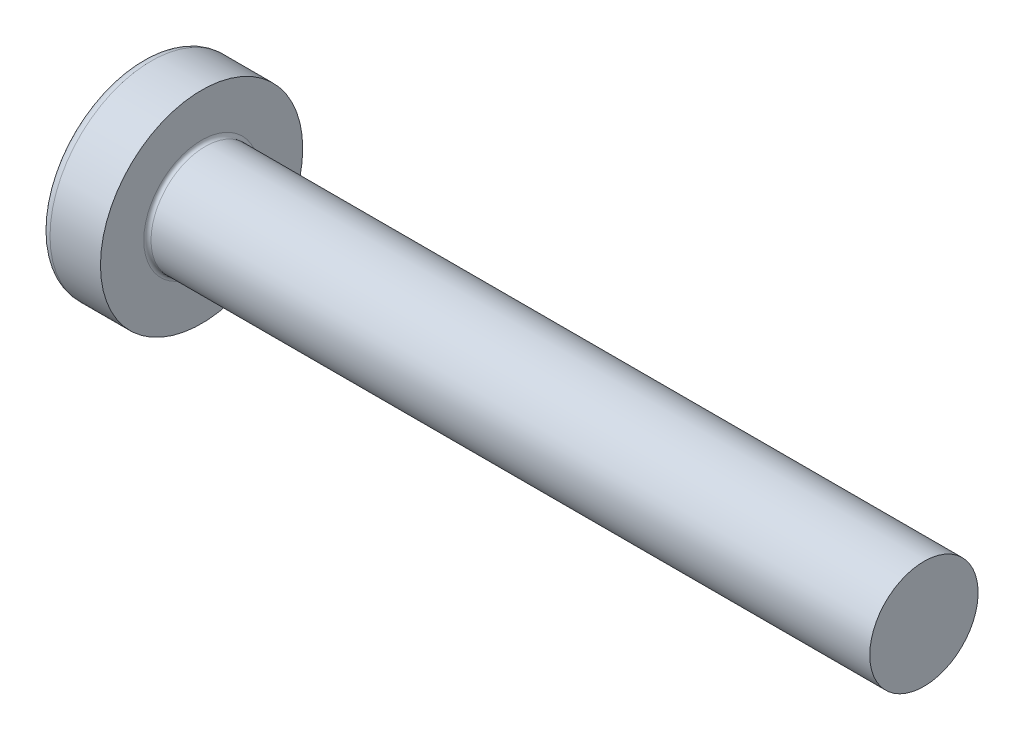
ISO-10303-21;
HEADER;
FILE_DESCRIPTION(('STEP AP214'),'2;1');
FILE_NAME('part.step','',(''),(''),'','','');
FILE_SCHEMA(('AUTOMOTIVE_DESIGN { 1 0 10303 214 1 1 1 1 }'));
ENDSEC;
DATA;
#1=APPLICATION_CONTEXT('core data for automotive mechanical design processes');
#2=APPLICATION_PROTOCOL_DEFINITION('international standard','automotive_design',2000,#1);
#3=PRODUCT_CONTEXT('',#1,'mechanical');
#4=PRODUCT('Part','Part','',(#3));
#5=PRODUCT_RELATED_PRODUCT_CATEGORY('part','',(#4));
#6=PRODUCT_DEFINITION_FORMATION('','',#4);
#7=PRODUCT_DEFINITION_CONTEXT('part definition',#1,'design');
#8=PRODUCT_DEFINITION('design','',#6,#7);
#9=PRODUCT_DEFINITION_SHAPE('','',#8);
#10=(LENGTH_UNIT() NAMED_UNIT(*) SI_UNIT(.MILLI.,.METRE.));
#11=(NAMED_UNIT(*) PLANE_ANGLE_UNIT() SI_UNIT($,.RADIAN.));
#12=(NAMED_UNIT(*) SI_UNIT($,.STERADIAN.) SOLID_ANGLE_UNIT());
#13=UNCERTAINTY_MEASURE_WITH_UNIT(LENGTH_MEASURE(1.E-05),#10,'distance_accuracy_value','');
#14=(GEOMETRIC_REPRESENTATION_CONTEXT(3) GLOBAL_UNCERTAINTY_ASSIGNED_CONTEXT((#13)) GLOBAL_UNIT_ASSIGNED_CONTEXT((#10,
#11,#12)) REPRESENTATION_CONTEXT('',''));
#15=CARTESIAN_POINT('',(0.,0.,0.));
#16=DIRECTION('',(0.,0.,1.));
#17=DIRECTION('',(1.,0.,0.));
#18=AXIS2_PLACEMENT_3D('',#15,#16,#17);
#19=CARTESIAN_POINT('',(5.,0.,0.));
#20=DIRECTION('',(-1.,0.,0.));
#21=DIRECTION('',(0.,1.,0.));
#22=AXIS2_PLACEMENT_3D('',#19,#20,#21);
#23=SPHERICAL_SURFACE('',#22,5.);
#24=CARTESIAN_POINT('',(0.775371598933733,0.,0.));
#25=DIRECTION('',(-1.,0.,0.));
#26=DIRECTION('',(0.,0.,1.));
#27=AXIS2_PLACEMENT_3D('',#24,#25,#26);
#28=CIRCLE('',#27,2.67441860465116);
#29=CARTESIAN_POINT('',(0.775371598933733,0.,2.67441860465116));
#30=VERTEX_POINT('',#29);
#31=EDGE_CURVE('E285',#30,#30,#28,.T.);
#32=ORIENTED_EDGE('',*,*,#31,.T.);
#33=EDGE_LOOP('',(#32));
#34=FACE_BOUND('',#33,.T.);
#35=CARTESIAN_POINT('',(0.0457951200896417,0.,0.));
#36=DIRECTION('',(1.,0.,0.));
#37=DIRECTION('',(0.,0.,-1.));
#38=AXIS2_PLACEMENT_3D('',#35,#36,#37);
#39=CIRCLE('',#38,0.675169614150692);
#40=CARTESIAN_POINT('',(0.0457951200896426,-0.369999999999998,-0.564760133040918));
#41=VERTEX_POINT('',#40);
#42=CARTESIAN_POINT('',(0.0457951200896417,-0.564760133040915,-0.37));
#43=VERTEX_POINT('',#42);
#44=EDGE_CURVE('E458',#41,#43,#39,.F.);
#45=ORIENTED_EDGE('',*,*,#44,.F.);
#46=CARTESIAN_POINT('',(5.,-0.37,0.));
#47=DIRECTION('',(0.,1.,0.));
#48=DIRECTION('',(0.,0.,1.));
#49=AXIS2_PLACEMENT_3D('',#46,#47,#48);
#50=CIRCLE('',#49,4.98629120689917);
#51=CARTESIAN_POINT('',(0.187869731256034,-0.369999999999995,-1.30633161051784));
#52=VERTEX_POINT('',#51);
#53=EDGE_CURVE('E365',#52,#41,#50,.T.);
#54=ORIENTED_EDGE('',*,*,#53,.F.);
#55=CARTESIAN_POINT('',(4.56358245832426,0.,0.875318202045668));
#56=DIRECTION('',(0.446197800778958,0.,-0.894934367749961));
#57=DIRECTION('',(-0.89493436774996,0.,-0.446197800778958));
#58=AXIS2_PLACEMENT_3D('',#55,#56,#57);
#59=CIRCLE('',#58,4.90340267309195);
#60=CARTESIAN_POINT('',(0.187869731256034,0.370000000000005,-1.30633161051784));
#61=VERTEX_POINT('',#60);
#62=EDGE_CURVE('E329',#52,#61,#59,.T.);
#63=ORIENTED_EDGE('',*,*,#62,.T.);
#64=CARTESIAN_POINT('',(5.,0.37,0.));
#65=DIRECTION('',(0.,-1.,0.));
#66=DIRECTION('',(0.,0.,-1.));
#67=AXIS2_PLACEMENT_3D('',#64,#65,#66);
#68=CIRCLE('',#67,4.98629120689917);
#69=CARTESIAN_POINT('',(0.0457951200896421,0.370000000000002,-0.564760133040916));
#70=VERTEX_POINT('',#69);
#71=EDGE_CURVE('E397',#70,#61,#68,.T.);
#72=ORIENTED_EDGE('',*,*,#71,.F.);
#73=CARTESIAN_POINT('',(0.0457951200896417,0.564760133040916,-0.37));
#74=VERTEX_POINT('',#73);
#75=EDGE_CURVE('E480',#74,#70,#39,.F.);
#76=ORIENTED_EDGE('',*,*,#75,.F.);
#77=CARTESIAN_POINT('',(5.,0.,-0.37));
#78=DIRECTION('',(0.,0.,1.));
#79=DIRECTION('',(1.,0.,0.));
#80=AXIS2_PLACEMENT_3D('',#77,#78,#79);
#81=CIRCLE('',#80,4.98629120689917);
#82=CARTESIAN_POINT('',(0.187869731256034,1.30633161051784,-0.37));
#83=VERTEX_POINT('',#82);
#84=EDGE_CURVE('E321',#83,#74,#81,.T.);
#85=ORIENTED_EDGE('',*,*,#84,.F.);
#86=CARTESIAN_POINT('',(4.56358245832426,-0.875318202045668,0.));
#87=DIRECTION('',(0.446197800778958,0.894934367749961,0.));
#88=DIRECTION('',(-0.89493436774996,0.446197800778958,0.));
#89=AXIS2_PLACEMENT_3D('',#86,#87,#88);
#90=CIRCLE('',#89,4.90340267309195);
#91=CARTESIAN_POINT('',(0.187869731256034,1.30633161051784,0.37));
#92=VERTEX_POINT('',#91);
#93=EDGE_CURVE('E325',#83,#92,#90,.T.);
#94=ORIENTED_EDGE('',*,*,#93,.T.);
#95=CARTESIAN_POINT('',(5.,0.,0.37));
#96=DIRECTION('',(0.,0.,-1.));
#97=DIRECTION('',(0.,1.,0.));
#98=AXIS2_PLACEMENT_3D('',#95,#96,#97);
#99=CIRCLE('',#98,4.98629120689917);
#100=CARTESIAN_POINT('',(0.0457951200896417,0.564760133040916,0.37));
#101=VERTEX_POINT('',#100);
#102=EDGE_CURVE('E316',#101,#92,#99,.T.);
#103=ORIENTED_EDGE('',*,*,#102,.F.);
#104=CARTESIAN_POINT('',(0.0457951200896426,0.369999999999998,0.564760133040918));
#105=VERTEX_POINT('',#104);
#106=EDGE_CURVE('E479',#105,#101,#39,.F.);
#107=ORIENTED_EDGE('',*,*,#106,.F.);
#108=CARTESIAN_POINT('',(0.187869731256034,0.369999999999995,1.30633161051784));
#109=VERTEX_POINT('',#108);
#110=EDGE_CURVE('E343',#109,#105,#68,.T.);
#111=ORIENTED_EDGE('',*,*,#110,.F.);
#112=CARTESIAN_POINT('',(4.56358245832426,0.,-0.875318202045669));
#113=DIRECTION('',(0.446197800778958,0.,0.894934367749961));
#114=DIRECTION('',(0.89493436774996,0.,-0.446197800778958));
#115=AXIS2_PLACEMENT_3D('',#112,#113,#114);
#116=CIRCLE('',#115,4.90340267309195);
#117=CARTESIAN_POINT('',(0.187869731256034,-0.370000000000005,1.30633161051784));
#118=VERTEX_POINT('',#117);
#119=EDGE_CURVE('E65',#109,#118,#116,.T.);
#120=ORIENTED_EDGE('',*,*,#119,.T.);
#121=CARTESIAN_POINT('',(0.0457951200896421,-0.370000000000002,0.564760133040916));
#122=VERTEX_POINT('',#121);
#123=EDGE_CURVE('E340',#122,#118,#50,.T.);
#124=ORIENTED_EDGE('',*,*,#123,.F.);
#125=CARTESIAN_POINT('',(0.0457951200896417,-0.564760133040916,0.37));
#126=VERTEX_POINT('',#125);
#127=EDGE_CURVE('E516',#126,#122,#39,.F.);
#128=ORIENTED_EDGE('',*,*,#127,.F.);
#129=CARTESIAN_POINT('',(0.187869731256034,-1.30633161051784,0.37));
#130=VERTEX_POINT('',#129);
#131=EDGE_CURVE('E317',#130,#126,#99,.T.);
#132=ORIENTED_EDGE('',*,*,#131,.F.);
#133=CARTESIAN_POINT('',(4.56358245832426,0.875318202045668,0.));
#134=DIRECTION('',(0.446197800778958,-0.894934367749961,0.));
#135=DIRECTION('',(0.89493436774996,0.446197800778958,0.));
#136=AXIS2_PLACEMENT_3D('',#133,#134,#135);
#137=CIRCLE('',#136,4.90340267309195);
#138=CARTESIAN_POINT('',(0.187869731256034,-1.30633161051784,-0.37));
#139=VERTEX_POINT('',#138);
#140=EDGE_CURVE('E312',#130,#139,#137,.T.);
#141=ORIENTED_EDGE('',*,*,#140,.T.);
#142=EDGE_CURVE('E82',#43,#139,#81,.T.);
#143=ORIENTED_EDGE('',*,*,#142,.F.);
#144=EDGE_LOOP('',(#45,#54,#63,#72,#76,#85,#94,#103,#107,#111,#120,#124,#128,#132,#141,#143));
#145=FACE_BOUND('',#144,.T.);
#146=ADVANCED_FACE('F52',(#34,#145),#23,.T.);
#147=CARTESIAN_POINT('',(1.75,0.527482216012805,-0.37));
#148=DIRECTION('',(0.,0.,1.));
#149=DIRECTION('',(1.,0.,0.));
#150=AXIS2_PLACEMENT_3D('',#147,#148,#149);
#151=PLANE('',#150);
#152=ORIENTED_EDGE('',*,*,#84,.T.);
#153=CARTESIAN_POINT('',(-0.987293237053716,0.649401255967161,-0.37));
#154=CARTESIAN_POINT('',(-0.781914975317084,0.632865887002871,-0.37));
#155=CARTESIAN_POINT('',(-0.576547882393372,0.616188977635081,-0.37));
#156=CARTESIAN_POINT('',(-0.165841599226327,0.582441031964227,-0.37));
#157=CARTESIAN_POINT('',(0.0394975903090452,0.56536998705488,-0.37));
#158=CARTESIAN_POINT('',(0.450133475422572,0.530723441326535,-0.37));
#159=CARTESIAN_POINT('',(0.655430171010573,0.513147940624557,-0.37));
#160=CARTESIAN_POINT('',(1.06596140177934,0.477314957985794,-0.37));
#161=CARTESIAN_POINT('',(1.2711959378071,0.459057485806066,-0.37));
#162=CARTESIAN_POINT('',(1.61065292365626,0.428051938688768,-0.37));
#163=CARTESIAN_POINT('',(1.74490059995643,0.415580824990931,-0.37));
#164=CARTESIAN_POINT('',(2.01334321762763,0.390092023404979,-0.37));
#165=CARTESIAN_POINT('',(2.14753815934577,0.377074339177353,-0.37));
#166=CARTESIAN_POINT('',(2.41586354151957,0.350315629452843,-0.37));
#167=CARTESIAN_POINT('',(2.5499939784531,0.33657456817765,-0.37));
#168=CARTESIAN_POINT('',(2.81814173295471,0.308004077741875,-0.37));
#169=CARTESIAN_POINT('',(2.95215904765134,0.293174621747065,-0.37));
#170=CARTESIAN_POINT('',(3.0860955068368,0.277618485071816,-0.37));
#171=B_SPLINE_CURVE_WITH_KNOTS('',3,(#153,#154,#155,#156,#157,#158,#159,#160,#161,#162,#163,
#164,#165,#166,#167,#168,#169,#170),.UNSPECIFIED.,.F.,.F.,(4,2,2,2,2,2,2,2,4),(0.,
0.618128793984691,1.23627109812525,1.85441325887562,2.4725465791681,2.87702276218609,
3.28149623678161,3.68598973550942,4.09049321032311),.UNSPECIFIED.);
#172=CARTESIAN_POINT('',(1.75,0.415013252800437,-0.37));
#173=VERTEX_POINT('',#172);
#174=EDGE_CURVE('E501',#74,#173,#171,.T.);
#175=ORIENTED_EDGE('',*,*,#174,.T.);
#176=DIRECTION('',(0.,1.,0.));
#177=VECTOR('',#176,1.);
#178=CARTESIAN_POINT('',(1.75,-0.527482216012805,-0.37));
#179=LINE('',#178,#177);
#180=CARTESIAN_POINT('',(1.75,0.527482216012805,-0.37));
#181=VERTEX_POINT('',#180);
#182=EDGE_CURVE('E436',#173,#181,#179,.T.);
#183=ORIENTED_EDGE('',*,*,#182,.T.);
#184=DIRECTION('',(0.89493436774996,-0.446197800778958,0.));
#185=VECTOR('',#184,1.);
#186=CARTESIAN_POINT('',(0.,1.4,-0.37));
#187=LINE('',#186,#185);
#188=EDGE_CURVE('E286',#83,#181,#187,.T.);
#189=ORIENTED_EDGE('',*,*,#188,.F.);
#190=EDGE_LOOP('',(#152,#175,#183,#189));
#191=FACE_BOUND('',#190,.T.);
#192=ADVANCED_FACE('F241',(#191),#151,.T.);
#193=CARTESIAN_POINT('',(1.75,-0.527482216012805,-0.37));
#194=VERTEX_POINT('',#193);
#195=CARTESIAN_POINT('',(1.75,-0.415013252800437,-0.37));
#196=VERTEX_POINT('',#195);
#197=EDGE_CURVE('E296',#194,#196,#179,.T.);
#198=ORIENTED_EDGE('',*,*,#197,.T.);
#199=CARTESIAN_POINT('',(-0.987293237053716,-0.649401255967161,-0.37));
#200=CARTESIAN_POINT('',(-0.781914975317084,-0.632865887002871,-0.37));
#201=CARTESIAN_POINT('',(-0.576547882393372,-0.616188977635081,-0.37));
#202=CARTESIAN_POINT('',(-0.165841599226327,-0.582441031964227,-0.37));
#203=CARTESIAN_POINT('',(0.0394975903090452,-0.56536998705488,-0.37));
#204=CARTESIAN_POINT('',(0.450133475422572,-0.530723441326535,-0.37));
#205=CARTESIAN_POINT('',(0.655430171010573,-0.513147940624557,-0.37));
#206=CARTESIAN_POINT('',(1.06596140177934,-0.477314957985794,-0.37));
#207=CARTESIAN_POINT('',(1.2711959378071,-0.459057485806066,-0.37));
#208=CARTESIAN_POINT('',(1.61065292365626,-0.428051938688768,-0.37));
#209=CARTESIAN_POINT('',(1.74490059995643,-0.415580824990931,-0.37));
#210=CARTESIAN_POINT('',(2.01334321762763,-0.390092023404979,-0.37));
#211=CARTESIAN_POINT('',(2.14753815934577,-0.377074339177353,-0.37));
#212=CARTESIAN_POINT('',(2.41586354151957,-0.350315629452843,-0.37));
#213=CARTESIAN_POINT('',(2.5499939784531,-0.33657456817765,-0.37));
#214=CARTESIAN_POINT('',(2.81814173295471,-0.308004077741875,-0.37));
#215=CARTESIAN_POINT('',(2.95215904765134,-0.293174621747065,-0.37));
#216=CARTESIAN_POINT('',(3.0860955068368,-0.277618485071816,-0.37));
#217=B_SPLINE_CURVE_WITH_KNOTS('',3,(#199,#200,#201,#202,#203,#204,#205,#206,#207,#208,#209,
#210,#211,#212,#213,#214,#215,#216),.UNSPECIFIED.,.F.,.F.,(4,2,2,2,2,2,2,2,4),(0.,
0.618128793984691,1.23627109812525,1.85441325887562,2.4725465791681,2.87702276218609,
3.28149623678161,3.68598973550942,4.09049321032311),.UNSPECIFIED.);
#218=EDGE_CURVE('E478',#196,#43,#217,.F.);
#219=ORIENTED_EDGE('',*,*,#218,.T.);
#220=ORIENTED_EDGE('',*,*,#142,.T.);
#221=DIRECTION('',(0.89493436774996,0.446197800778958,0.));
#222=VECTOR('',#221,1.);
#223=CARTESIAN_POINT('',(0.,-1.4,-0.37));
#224=LINE('',#223,#222);
#225=EDGE_CURVE('E401',#139,#194,#224,.T.);
#226=ORIENTED_EDGE('',*,*,#225,.T.);
#227=EDGE_LOOP('',(#198,#219,#220,#226));
#228=FACE_BOUND('',#227,.T.);
#229=ADVANCED_FACE('F247',(#228),#151,.T.);
#230=CARTESIAN_POINT('',(1.75,-0.527482216012805,0.37));
#231=DIRECTION('',(0.,0.,-1.));
#232=DIRECTION('',(0.,1.,0.));
#233=AXIS2_PLACEMENT_3D('',#230,#231,#232);
#234=PLANE('',#233);
#235=DIRECTION('',(0.,-1.,0.));
#236=VECTOR('',#235,1.);
#237=CARTESIAN_POINT('',(1.75,0.527482216012805,0.37));
#238=LINE('',#237,#236);
#239=CARTESIAN_POINT('',(1.75,0.527482216012805,0.37));
#240=VERTEX_POINT('',#239);
#241=CARTESIAN_POINT('',(1.75,0.415013252800437,0.37));
#242=VERTEX_POINT('',#241);
#243=EDGE_CURVE('E412',#240,#242,#238,.T.);
#244=ORIENTED_EDGE('',*,*,#243,.T.);
#245=CARTESIAN_POINT('',(-0.987293237069635,0.649401255968442,0.37));
#246=CARTESIAN_POINT('',(-0.781914975331301,0.632865887004023,0.37));
#247=CARTESIAN_POINT('',(-0.576547882405888,0.616188977636102,0.37));
#248=CARTESIAN_POINT('',(-0.16584159923544,0.582441031964983,0.37));
#249=CARTESIAN_POINT('',(0.0394975903016338,0.5653699870555,0.37));
#250=CARTESIAN_POINT('',(0.450133475420601,0.530723441326706,0.37));
#251=CARTESIAN_POINT('',(0.655430171012341,0.513147940624409,0.37));
#252=CARTESIAN_POINT('',(1.06596140178858,0.477314957984981,0.37));
#253=CARTESIAN_POINT('',(1.27119593782008,0.459057485804908,0.37));
#254=CARTESIAN_POINT('',(1.61065292367297,0.428051938687225,0.37));
#255=CARTESIAN_POINT('',(1.74490059997313,0.415580824989367,0.37));
#256=CARTESIAN_POINT('',(2.01334321764434,0.39009202340337,0.37));
#257=CARTESIAN_POINT('',(2.14753815936247,0.377074339175718,0.37));
#258=CARTESIAN_POINT('',(2.41586354153627,0.350315629451146,0.37));
#259=CARTESIAN_POINT('',(2.54999397846979,0.336574568175918,0.37));
#260=CARTESIAN_POINT('',(2.8181417329714,0.308004077740054,0.37));
#261=CARTESIAN_POINT('',(2.95215904766802,0.29317462174519,0.37));
#262=CARTESIAN_POINT('',(3.08609550685347,0.277618485069873,0.37));
#263=B_SPLINE_CURVE_WITH_KNOTS('',3,(#245,#246,#247,#248,#249,#250,#251,#252,#253,#254,#255,
#256,#257,#258,#259,#260,#261,#262),.UNSPECIFIED.,.F.,.F.,(4,2,2,2,2,2,2,2,4),(0.,
0.61812879398981,1.23627109813549,1.85441325889711,2.47254657920086,2.87702276221884,
3.28149623681436,3.68598973554218,4.09049321035586),.UNSPECIFIED.);
#264=EDGE_CURVE('E763',#242,#101,#263,.F.);
#265=ORIENTED_EDGE('',*,*,#264,.T.);
#266=ORIENTED_EDGE('',*,*,#102,.T.);
#267=DIRECTION('',(0.89493436774996,-0.446197800778958,0.));
#268=VECTOR('',#267,1.);
#269=CARTESIAN_POINT('',(0.,1.4,0.37));
#270=LINE('',#269,#268);
#271=EDGE_CURVE('E293',#92,#240,#270,.T.);
#272=ORIENTED_EDGE('',*,*,#271,.T.);
#273=EDGE_LOOP('',(#244,#265,#266,#272));
#274=FACE_BOUND('',#273,.T.);
#275=ADVANCED_FACE('F497',(#274),#234,.T.);
#276=ORIENTED_EDGE('',*,*,#131,.T.);
#277=CARTESIAN_POINT('',(-0.987293237069635,-0.649401255968442,0.37));
#278=CARTESIAN_POINT('',(-0.781914975331301,-0.632865887004023,0.37));
#279=CARTESIAN_POINT('',(-0.576547882405888,-0.616188977636102,0.37));
#280=CARTESIAN_POINT('',(-0.16584159923544,-0.582441031964983,0.37));
#281=CARTESIAN_POINT('',(0.0394975903016338,-0.5653699870555,0.37));
#282=CARTESIAN_POINT('',(0.450133475420601,-0.530723441326706,0.37));
#283=CARTESIAN_POINT('',(0.655430171012341,-0.513147940624409,0.37));
#284=CARTESIAN_POINT('',(1.06596140178858,-0.477314957984981,0.37));
#285=CARTESIAN_POINT('',(1.27119593782008,-0.459057485804908,0.37));
#286=CARTESIAN_POINT('',(1.61065292367297,-0.428051938687225,0.37));
#287=CARTESIAN_POINT('',(1.74490059997313,-0.415580824989367,0.37));
#288=CARTESIAN_POINT('',(2.01334321764434,-0.390092023403371,0.37));
#289=CARTESIAN_POINT('',(2.14753815936247,-0.377074339175718,0.37));
#290=CARTESIAN_POINT('',(2.41586354153627,-0.350315629451146,0.37));
#291=CARTESIAN_POINT('',(2.54999397846979,-0.336574568175918,0.37));
#292=CARTESIAN_POINT('',(2.8181417329714,-0.308004077740054,0.37));
#293=CARTESIAN_POINT('',(2.95215904766802,-0.29317462174519,0.37));
#294=CARTESIAN_POINT('',(3.08609550685347,-0.277618485069873,0.37));
#295=B_SPLINE_CURVE_WITH_KNOTS('',3,(#277,#278,#279,#280,#281,#282,#283,#284,#285,#286,#287,
#288,#289,#290,#291,#292,#293,#294),.UNSPECIFIED.,.F.,.F.,(4,2,2,2,2,2,2,2,4),(0.,
0.61812879398981,1.23627109813549,1.85441325889711,2.47254657920086,2.87702276221884,
3.28149623681436,3.68598973554218,4.09049321035586),.UNSPECIFIED.);
#296=CARTESIAN_POINT('',(1.75,-0.415013252800437,0.37));
#297=VERTEX_POINT('',#296);
#298=EDGE_CURVE('E517',#126,#297,#295,.T.);
#299=ORIENTED_EDGE('',*,*,#298,.T.);
#300=CARTESIAN_POINT('',(1.75,-0.527482216012805,0.37));
#301=VERTEX_POINT('',#300);
#302=EDGE_CURVE('E415',#297,#301,#238,.T.);
#303=ORIENTED_EDGE('',*,*,#302,.T.);
#304=DIRECTION('',(0.89493436774996,0.446197800778958,0.));
#305=VECTOR('',#304,1.);
#306=CARTESIAN_POINT('',(0.,-1.4,0.37));
#307=LINE('',#306,#305);
#308=EDGE_CURVE('E404',#130,#301,#307,.T.);
#309=ORIENTED_EDGE('',*,*,#308,.F.);
#310=EDGE_LOOP('',(#276,#299,#303,#309));
#311=FACE_BOUND('',#310,.T.);
#312=ADVANCED_FACE('F608',(#311),#234,.T.);
#313=CARTESIAN_POINT('',(1.75,0.527482216012805,0.37));
#314=DIRECTION('',(0.446197800778958,0.894934367749961,0.));
#315=DIRECTION('',(-0.89493436774996,0.446197800778958,0.));
#316=AXIS2_PLACEMENT_3D('',#313,#314,#315);
#317=PLANE('',#316);
#318=CARTESIAN_POINT('',(2.66965234556629,0.0689604865315897,0.));
#319=DIRECTION('',(0.446197800778958,0.894934367749961,0.));
#320=DIRECTION('',(-0.89493436774996,0.446197800778958,0.));
#321=AXIS2_PLACEMENT_3D('',#318,#319,#320);
#322=ELLIPSE('',#321,1.10195891266117,0.486831719863514);
#323=CARTESIAN_POINT('',(1.75,0.527482216012806,0.175779725196678));
#324=VERTEX_POINT('',#323);
#325=CARTESIAN_POINT('',(1.75,0.527482216012806,-0.175779725196678));
#326=VERTEX_POINT('',#325);
#327=EDGE_CURVE('E371',#324,#326,#322,.F.);
#328=ORIENTED_EDGE('',*,*,#327,.F.);
#329=DIRECTION('',(0.,0.,-1.));
#330=VECTOR('',#329,1.);
#331=CARTESIAN_POINT('',(1.75,0.527482216012805,0.37));
#332=LINE('',#331,#330);
#333=EDGE_CURVE('E416',#240,#324,#332,.T.);
#334=ORIENTED_EDGE('',*,*,#333,.F.);
#335=ORIENTED_EDGE('',*,*,#271,.F.);
#336=ORIENTED_EDGE('',*,*,#93,.F.);
#337=ORIENTED_EDGE('',*,*,#188,.T.);
#338=EDGE_CURVE('E419',#326,#181,#332,.T.);
#339=ORIENTED_EDGE('',*,*,#338,.F.);
#340=EDGE_LOOP('',(#328,#334,#335,#336,#337,#339));
#341=FACE_BOUND('',#340,.T.);
#342=ADVANCED_FACE('F495',(#341),#317,.F.);
#343=CARTESIAN_POINT('',(0.,-1.4,-0.37));
#344=DIRECTION('',(0.446197800778958,-0.894934367749961,0.));
#345=DIRECTION('',(0.89493436774996,0.446197800778958,0.));
#346=AXIS2_PLACEMENT_3D('',#343,#344,#345);
#347=PLANE('',#346);
#348=CARTESIAN_POINT('',(2.66965234556629,-0.0689604865315897,0.));
#349=DIRECTION('',(0.446197800778958,-0.894934367749961,0.));
#350=DIRECTION('',(-0.89493436774996,-0.446197800778958,0.));
#351=AXIS2_PLACEMENT_3D('',#348,#349,#350);
#352=ELLIPSE('',#351,1.10195891266117,0.486831719863514);
#353=CARTESIAN_POINT('',(1.75,-0.527482216012806,-0.175779725196678));
#354=VERTEX_POINT('',#353);
#355=CARTESIAN_POINT('',(1.75,-0.527482216012806,0.175779725196678));
#356=VERTEX_POINT('',#355);
#357=EDGE_CURVE('E765',#354,#356,#352,.F.);
#358=ORIENTED_EDGE('',*,*,#357,.F.);
#359=DIRECTION('',(0.,0.,1.));
#360=VECTOR('',#359,1.);
#361=CARTESIAN_POINT('',(1.75,-0.527482216012805,-0.37));
#362=LINE('',#361,#360);
#363=EDGE_CURVE('E408',#194,#354,#362,.T.);
#364=ORIENTED_EDGE('',*,*,#363,.F.);
#365=ORIENTED_EDGE('',*,*,#225,.F.);
#366=ORIENTED_EDGE('',*,*,#140,.F.);
#367=ORIENTED_EDGE('',*,*,#308,.T.);
#368=EDGE_CURVE('E411',#356,#301,#362,.T.);
#369=ORIENTED_EDGE('',*,*,#368,.F.);
#370=EDGE_LOOP('',(#358,#364,#365,#366,#367,#369));
#371=FACE_BOUND('',#370,.T.);
#372=ADVANCED_FACE('F595',(#371),#347,.F.);
#373=CARTESIAN_POINT('',(1.75,0.527482216012805,-0.37));
#374=DIRECTION('',(-1.,0.,0.));
#375=DIRECTION('',(0.,0.,1.));
#376=AXIS2_PLACEMENT_3D('',#373,#374,#375);
#377=PLANE('',#376);
#378=DIRECTION('',(0.,1.,0.));
#379=VECTOR('',#378,1.);
#380=CARTESIAN_POINT('',(1.75,-0.370000000000002,0.527482216012804));
#381=LINE('',#380,#379);
#382=CARTESIAN_POINT('',(1.75,-0.370000000000002,0.527482216012804));
#383=VERTEX_POINT('',#382);
#384=CARTESIAN_POINT('',(1.75,-0.175779725196681,0.527482216012805));
#385=VERTEX_POINT('',#384);
#386=EDGE_CURVE('E388',#383,#385,#381,.T.);
#387=ORIENTED_EDGE('',*,*,#386,.T.);
#388=CARTESIAN_POINT('',(1.75,0.,0.));
#389=DIRECTION('',(-1.,0.,0.));
#390=DIRECTION('',(0.,0.,1.));
#391=AXIS2_PLACEMENT_3D('',#388,#389,#390);
#392=CIRCLE('',#391,0.556);
#393=CARTESIAN_POINT('',(1.75,-0.370000000000001,0.415013252800436));
#394=VERTEX_POINT('',#393);
#395=EDGE_CURVE('E792',#394,#385,#392,.T.);
#396=ORIENTED_EDGE('',*,*,#395,.F.);
#397=DIRECTION('',(0.,0.,-1.));
#398=VECTOR('',#397,1.);
#399=CARTESIAN_POINT('',(1.75,-0.370000000000002,0.527482216012804));
#400=LINE('',#399,#398);
#401=EDGE_CURVE('E384',#383,#394,#400,.T.);
#402=ORIENTED_EDGE('',*,*,#401,.F.);
#403=EDGE_LOOP('',(#387,#396,#402));
#404=FACE_BOUND('',#403,.T.);
#405=ADVANCED_FACE('F552',(#404),#377,.T.);
#406=ORIENTED_EDGE('',*,*,#302,.F.);
#407=EDGE_CURVE('E797',#356,#297,#392,.T.);
#408=ORIENTED_EDGE('',*,*,#407,.F.);
#409=ORIENTED_EDGE('',*,*,#368,.T.);
#410=EDGE_LOOP('',(#406,#408,#409));
#411=FACE_BOUND('',#410,.T.);
#412=ADVANCED_FACE('F582',(#411),#377,.T.);
#413=ORIENTED_EDGE('',*,*,#363,.T.);
#414=EDGE_CURVE('E471',#196,#354,#392,.T.);
#415=ORIENTED_EDGE('',*,*,#414,.F.);
#416=ORIENTED_EDGE('',*,*,#197,.F.);
#417=EDGE_LOOP('',(#413,#415,#416));
#418=FACE_BOUND('',#417,.T.);
#419=ADVANCED_FACE('F576',(#418),#377,.T.);
#420=CARTESIAN_POINT('',(1.75,-0.369999999999998,-0.415013252800438));
#421=VERTEX_POINT('',#420);
#422=CARTESIAN_POINT('',(1.75,-0.369999999999998,-0.527482216012807));
#423=VERTEX_POINT('',#422);
#424=EDGE_CURVE('E387',#421,#423,#400,.T.);
#425=ORIENTED_EDGE('',*,*,#424,.F.);
#426=CARTESIAN_POINT('',(1.75,-0.175779725196678,-0.527482216012806));
#427=VERTEX_POINT('',#426);
#428=EDGE_CURVE('E72',#427,#421,#392,.T.);
#429=ORIENTED_EDGE('',*,*,#428,.F.);
#430=DIRECTION('',(0.,-1.,0.));
#431=VECTOR('',#430,1.);
#432=CARTESIAN_POINT('',(1.75,0.370000000000002,-0.527482216012804));
#433=LINE('',#432,#431);
#434=EDGE_CURVE('E383',#427,#423,#433,.T.);
#435=ORIENTED_EDGE('',*,*,#434,.T.);
#436=EDGE_LOOP('',(#425,#429,#435));
#437=FACE_BOUND('',#436,.T.);
#438=ADVANCED_FACE('F466',(#437),#377,.T.);
#439=CARTESIAN_POINT('',(1.75,0.370000000000002,-0.527482216012804));
#440=VERTEX_POINT('',#439);
#441=CARTESIAN_POINT('',(1.75,0.175779725196682,-0.527482216012805));
#442=VERTEX_POINT('',#441);
#443=EDGE_CURVE('E380',#440,#442,#433,.T.);
#444=ORIENTED_EDGE('',*,*,#443,.T.);
#445=CARTESIAN_POINT('',(1.75,0.370000000000001,-0.415013252800436));
#446=VERTEX_POINT('',#445);
#447=EDGE_CURVE('E470',#446,#442,#392,.T.);
#448=ORIENTED_EDGE('',*,*,#447,.F.);
#449=DIRECTION('',(0.,0.,1.));
#450=VECTOR('',#449,1.);
#451=CARTESIAN_POINT('',(1.75,0.370000000000002,-0.527482216012804));
#452=LINE('',#451,#450);
#453=EDGE_CURVE('E393',#440,#446,#452,.T.);
#454=ORIENTED_EDGE('',*,*,#453,.F.);
#455=EDGE_LOOP('',(#444,#448,#454));
#456=FACE_BOUND('',#455,.T.);
#457=ADVANCED_FACE('F564',(#456),#377,.T.);
#458=ORIENTED_EDGE('',*,*,#182,.F.);
#459=EDGE_CURVE('E809',#326,#173,#392,.T.);
#460=ORIENTED_EDGE('',*,*,#459,.F.);
#461=ORIENTED_EDGE('',*,*,#338,.T.);
#462=EDGE_LOOP('',(#458,#460,#461));
#463=FACE_BOUND('',#462,.T.);
#464=ADVANCED_FACE('F558',(#463),#377,.T.);
#465=ORIENTED_EDGE('',*,*,#333,.T.);
#466=EDGE_CURVE('E803',#242,#324,#392,.T.);
#467=ORIENTED_EDGE('',*,*,#466,.F.);
#468=ORIENTED_EDGE('',*,*,#243,.F.);
#469=EDGE_LOOP('',(#465,#467,#468));
#470=FACE_BOUND('',#469,.T.);
#471=ADVANCED_FACE('F550',(#470),#377,.T.);
#472=CARTESIAN_POINT('',(1.75,0.369999999999999,0.415013252800439));
#473=VERTEX_POINT('',#472);
#474=CARTESIAN_POINT('',(1.75,0.369999999999998,0.527482216012807));
#475=VERTEX_POINT('',#474);
#476=EDGE_CURVE('E358',#473,#475,#452,.T.);
#477=ORIENTED_EDGE('',*,*,#476,.F.);
#478=CARTESIAN_POINT('',(1.75,0.175779725196678,0.527482216012806));
#479=VERTEX_POINT('',#478);
#480=EDGE_CURVE('E472',#479,#473,#392,.T.);
#481=ORIENTED_EDGE('',*,*,#480,.F.);
#482=EDGE_CURVE('E392',#479,#475,#381,.T.);
#483=ORIENTED_EDGE('',*,*,#482,.T.);
#484=EDGE_LOOP('',(#477,#481,#483));
#485=FACE_BOUND('',#484,.T.);
#486=ADVANCED_FACE('F544',(#485),#377,.T.);
#487=CARTESIAN_POINT('',(1.75,0.369999999999998,0.527482216012806));
#488=DIRECTION('',(0.,-1.,0.));
#489=DIRECTION('',(1.,0.,0.));
#490=AXIS2_PLACEMENT_3D('',#487,#488,#489);
#491=PLANE('',#490);
#492=ORIENTED_EDGE('',*,*,#110,.T.);
#493=CARTESIAN_POINT('',(-0.987293237069635,0.369999999999998,0.649401255968443));
#494=CARTESIAN_POINT('',(-0.781914975331301,0.369999999999998,0.632865887004024));
#495=CARTESIAN_POINT('',(-0.576547882405888,0.369999999999998,0.616188977636103));
#496=CARTESIAN_POINT('',(-0.16584159923544,0.369999999999998,0.582441031964984));
#497=CARTESIAN_POINT('',(0.0394975903016338,0.369999999999998,0.565369987055501));
#498=CARTESIAN_POINT('',(0.450133475420601,0.369999999999998,0.530723441326707));
#499=CARTESIAN_POINT('',(0.655430171012341,0.369999999999998,0.51314794062441));
#500=CARTESIAN_POINT('',(1.06596140178858,0.369999999999998,0.477314957984982));
#501=CARTESIAN_POINT('',(1.27119593782008,0.369999999999998,0.459057485804909));
#502=CARTESIAN_POINT('',(1.61065292367297,0.369999999999999,0.428051938687226));
#503=CARTESIAN_POINT('',(1.74490059997313,0.369999999999999,0.415580824989369));
#504=CARTESIAN_POINT('',(2.01334321764434,0.369999999999999,0.390092023403372));
#505=CARTESIAN_POINT('',(2.14753815936247,0.369999999999999,0.37707433917572));
#506=CARTESIAN_POINT('',(2.41586354153627,0.369999999999999,0.350315629451147));
#507=CARTESIAN_POINT('',(2.54999397846979,0.369999999999999,0.336574568175919));
#508=CARTESIAN_POINT('',(2.8181417329714,0.369999999999999,0.308004077740055));
#509=CARTESIAN_POINT('',(2.95215904766802,0.369999999999999,0.293174621745191));
#510=CARTESIAN_POINT('',(3.08609550685347,0.369999999999999,0.277618485069875));
#511=B_SPLINE_CURVE_WITH_KNOTS('',3,(#493,#494,#495,#496,#497,#498,#499,#500,#501,#502,#503,
#504,#505,#506,#507,#508,#509,#510),.UNSPECIFIED.,.F.,.F.,(4,2,2,2,2,2,2,2,4),(0.,
0.61812879398981,1.23627109813549,1.85441325889711,2.47254657920086,2.87702276221884,
3.28149623681436,3.68598973554218,4.09049321035586),.UNSPECIFIED.);
#512=EDGE_CURVE('E762',#105,#473,#511,.T.);
#513=ORIENTED_EDGE('',*,*,#512,.T.);
#514=ORIENTED_EDGE('',*,*,#476,.T.);
#515=DIRECTION('',(0.89493436774996,0.,-0.446197800778958));
#516=VECTOR('',#515,1.);
#517=CARTESIAN_POINT('',(0.,0.369999999999995,1.4));
#518=LINE('',#517,#516);
#519=EDGE_CURVE('E351',#109,#475,#518,.T.);
#520=ORIENTED_EDGE('',*,*,#519,.F.);
#521=EDGE_LOOP('',(#492,#513,#514,#520));
#522=FACE_BOUND('',#521,.T.);
#523=ADVANCED_FACE('F355',(#522),#491,.T.);
#524=CARTESIAN_POINT('',(1.75,-0.369999999999998,-0.527482216012807));
#525=DIRECTION('',(0.,1.,0.));
#526=DIRECTION('',(0.,0.,1.));
#527=AXIS2_PLACEMENT_3D('',#524,#525,#526);
#528=PLANE('',#527);
#529=ORIENTED_EDGE('',*,*,#401,.T.);
#530=CARTESIAN_POINT('',(-0.987293237053716,-0.370000000000002,0.649401255967159));
#531=CARTESIAN_POINT('',(-0.781914975317084,-0.370000000000002,0.63286588700287));
#532=CARTESIAN_POINT('',(-0.576547882393372,-0.370000000000002,0.616188977635079));
#533=CARTESIAN_POINT('',(-0.165841599226327,-0.370000000000002,0.582441031964225));
#534=CARTESIAN_POINT('',(0.039497590309045,-0.370000000000002,0.565369987054878));
#535=CARTESIAN_POINT('',(0.450133475422572,-0.370000000000002,0.530723441326534));
#536=CARTESIAN_POINT('',(0.655430171010573,-0.370000000000002,0.513147940624556));
#537=CARTESIAN_POINT('',(1.06596140177934,-0.370000000000002,0.477314957985792));
#538=CARTESIAN_POINT('',(1.2711959378071,-0.370000000000002,0.459057485806065));
#539=CARTESIAN_POINT('',(1.61065292365626,-0.370000000000001,0.428051938688767));
#540=CARTESIAN_POINT('',(1.74490059995642,-0.370000000000001,0.41558082499093));
#541=CARTESIAN_POINT('',(2.01334321762763,-0.370000000000001,0.390092023404978));
#542=CARTESIAN_POINT('',(2.14753815934577,-0.370000000000001,0.377074339177352));
#543=CARTESIAN_POINT('',(2.41586354151957,-0.370000000000001,0.350315629452841));
#544=CARTESIAN_POINT('',(2.5499939784531,-0.370000000000001,0.336574568177649));
#545=CARTESIAN_POINT('',(2.81814173295471,-0.370000000000001,0.308004077741874));
#546=CARTESIAN_POINT('',(2.95215904765134,-0.370000000000001,0.293174621747064));
#547=CARTESIAN_POINT('',(3.0860955068368,-0.370000000000001,0.277618485071814));
#548=B_SPLINE_CURVE_WITH_KNOTS('',3,(#530,#531,#532,#533,#534,#535,#536,#537,#538,#539,#540,
#541,#542,#543,#544,#545,#546,#547),.UNSPECIFIED.,.F.,.F.,(4,2,2,2,2,2,2,2,4),(0.,
0.618128793984691,1.23627109812525,1.85441325887562,2.4725465791681,2.87702276218609,
3.28149623678161,3.68598973550942,4.09049321032311),.UNSPECIFIED.);
#549=EDGE_CURVE('E509',#394,#122,#548,.F.);
#550=ORIENTED_EDGE('',*,*,#549,.T.);
#551=ORIENTED_EDGE('',*,*,#123,.T.);
#552=DIRECTION('',(0.89493436774996,0.,-0.446197800778958));
#553=VECTOR('',#552,1.);
#554=CARTESIAN_POINT('',(0.,-0.370000000000005,1.4));
#555=LINE('',#554,#553);
#556=EDGE_CURVE('E353',#118,#383,#555,.T.);
#557=ORIENTED_EDGE('',*,*,#556,.T.);
#558=EDGE_LOOP('',(#529,#550,#551,#557));
#559=FACE_BOUND('',#558,.T.);
#560=ADVANCED_FACE('F276',(#559),#528,.T.);
#561=CARTESIAN_POINT('',(1.75,-0.370000000000002,0.527482216012804));
#562=DIRECTION('',(0.446197800778958,0.,0.894934367749961));
#563=DIRECTION('',(-0.89493436774996,0.,0.446197800778958));
#564=AXIS2_PLACEMENT_3D('',#561,#562,#563);
#565=PLANE('',#564);
#566=CARTESIAN_POINT('',(2.66965234556629,0.,0.0689604865315897));
#567=DIRECTION('',(0.446197800778958,0.,0.894934367749961));
#568=DIRECTION('',(-0.89493436774996,0.,0.446197800778958));
#569=AXIS2_PLACEMENT_3D('',#566,#567,#568);
#570=ELLIPSE('',#569,1.10195891266117,0.486831719863514);
#571=EDGE_CURVE('E507',#385,#479,#570,.F.);
#572=ORIENTED_EDGE('',*,*,#571,.F.);
#573=ORIENTED_EDGE('',*,*,#386,.F.);
#574=ORIENTED_EDGE('',*,*,#556,.F.);
#575=ORIENTED_EDGE('',*,*,#119,.F.);
#576=ORIENTED_EDGE('',*,*,#519,.T.);
#577=ORIENTED_EDGE('',*,*,#482,.F.);
#578=EDGE_LOOP('',(#572,#573,#574,#575,#576,#577));
#579=FACE_BOUND('',#578,.T.);
#580=ADVANCED_FACE('F349',(#579),#565,.F.);
#581=CARTESIAN_POINT('',(0.,0.370000000000005,-1.4));
#582=DIRECTION('',(0.446197800778958,0.,-0.894934367749961));
#583=DIRECTION('',(0.89493436774996,0.,0.446197800778958));
#584=AXIS2_PLACEMENT_3D('',#581,#582,#583);
#585=PLANE('',#584);
#586=CARTESIAN_POINT('',(2.66965234556629,0.,-0.0689604865315896));
#587=DIRECTION('',(0.446197800778958,0.,-0.894934367749961));
#588=DIRECTION('',(-0.89493436774996,0.,-0.446197800778958));
#589=AXIS2_PLACEMENT_3D('',#586,#587,#588);
#590=ELLIPSE('',#589,1.10195891266117,0.486831719863514);
#591=EDGE_CURVE('E464',#442,#427,#590,.F.);
#592=ORIENTED_EDGE('',*,*,#591,.F.);
#593=ORIENTED_EDGE('',*,*,#443,.F.);
#594=DIRECTION('',(0.89493436774996,0.,0.446197800778958));
#595=VECTOR('',#594,1.);
#596=CARTESIAN_POINT('',(0.,0.370000000000005,-1.4));
#597=LINE('',#596,#595);
#598=EDGE_CURVE('E368',#61,#440,#597,.T.);
#599=ORIENTED_EDGE('',*,*,#598,.F.);
#600=ORIENTED_EDGE('',*,*,#62,.F.);
#601=DIRECTION('',(0.89493436774996,0.,0.446197800778958));
#602=VECTOR('',#601,1.);
#603=CARTESIAN_POINT('',(0.,-0.369999999999995,-1.4));
#604=LINE('',#603,#602);
#605=EDGE_CURVE('E376',#52,#423,#604,.T.);
#606=ORIENTED_EDGE('',*,*,#605,.T.);
#607=ORIENTED_EDGE('',*,*,#434,.F.);
#608=EDGE_LOOP('',(#592,#593,#599,#600,#606,#607));
#609=FACE_BOUND('',#608,.T.);
#610=ADVANCED_FACE('F453',(#609),#585,.F.);
#611=ORIENTED_EDGE('',*,*,#453,.T.);
#612=CARTESIAN_POINT('',(-0.987293237053716,0.370000000000002,-0.649401255967159));
#613=CARTESIAN_POINT('',(-0.781914975317084,0.370000000000002,-0.63286588700287));
#614=CARTESIAN_POINT('',(-0.576547882393372,0.370000000000002,-0.61618897763508));
#615=CARTESIAN_POINT('',(-0.165841599226327,0.370000000000002,-0.582441031964225));
#616=CARTESIAN_POINT('',(0.039497590309045,0.370000000000002,-0.565369987054878));
#617=CARTESIAN_POINT('',(0.450133475422572,0.370000000000002,-0.530723441326533));
#618=CARTESIAN_POINT('',(0.655430171010573,0.370000000000002,-0.513147940624555));
#619=CARTESIAN_POINT('',(1.06596140177934,0.370000000000002,-0.477314957985793));
#620=CARTESIAN_POINT('',(1.2711959378071,0.370000000000002,-0.459057485806065));
#621=CARTESIAN_POINT('',(1.61065292365626,0.370000000000001,-0.428051938688767));
#622=CARTESIAN_POINT('',(1.74490059995642,0.370000000000001,-0.41558082499093));
#623=CARTESIAN_POINT('',(2.01334321762763,0.370000000000001,-0.390092023404978));
#624=CARTESIAN_POINT('',(2.14753815934577,0.370000000000001,-0.377074339177352));
#625=CARTESIAN_POINT('',(2.41586354151957,0.370000000000001,-0.350315629452841));
#626=CARTESIAN_POINT('',(2.5499939784531,0.370000000000001,-0.336574568177649));
#627=CARTESIAN_POINT('',(2.81814173295471,0.370000000000001,-0.308004077741874));
#628=CARTESIAN_POINT('',(2.95215904765134,0.370000000000001,-0.293174621747064));
#629=CARTESIAN_POINT('',(3.0860955068368,0.370000000000001,-0.277618485071814));
#630=B_SPLINE_CURVE_WITH_KNOTS('',3,(#612,#613,#614,#615,#616,#617,#618,#619,#620,#621,#622,
#623,#624,#625,#626,#627,#628,#629),.UNSPECIFIED.,.F.,.F.,(4,2,2,2,2,2,2,2,4),(0.,
0.618128793984691,1.23627109812525,1.85441325887562,2.4725465791681,2.87702276218609,
3.28149623678161,3.68598973550942,4.09049321032311),.UNSPECIFIED.);
#631=EDGE_CURVE('E449',#446,#70,#630,.F.);
#632=ORIENTED_EDGE('',*,*,#631,.T.);
#633=ORIENTED_EDGE('',*,*,#71,.T.);
#634=ORIENTED_EDGE('',*,*,#598,.T.);
#635=EDGE_LOOP('',(#611,#632,#633,#634));
#636=FACE_BOUND('',#635,.T.);
#637=ADVANCED_FACE('F274',(#636),#491,.T.);
#638=ORIENTED_EDGE('',*,*,#53,.T.);
#639=CARTESIAN_POINT('',(-0.987293237053716,-0.369999999999998,-0.649401255967162));
#640=CARTESIAN_POINT('',(-0.781914975317084,-0.369999999999998,-0.632865887002873));
#641=CARTESIAN_POINT('',(-0.576547882393372,-0.369999999999998,-0.616188977635082));
#642=CARTESIAN_POINT('',(-0.165841599226327,-0.369999999999998,-0.582441031964228));
#643=CARTESIAN_POINT('',(0.0394975903090453,-0.369999999999998,-0.565369987054881));
#644=CARTESIAN_POINT('',(0.450133475422572,-0.369999999999998,-0.530723441326536));
#645=CARTESIAN_POINT('',(0.655430171010573,-0.369999999999998,-0.513147940624558));
#646=CARTESIAN_POINT('',(1.06596140177934,-0.369999999999998,-0.477314957985795));
#647=CARTESIAN_POINT('',(1.2711959378071,-0.369999999999998,-0.459057485806067));
#648=CARTESIAN_POINT('',(1.61065292365626,-0.369999999999998,-0.42805193868877));
#649=CARTESIAN_POINT('',(1.74490059995643,-0.369999999999998,-0.415580824990932));
#650=CARTESIAN_POINT('',(2.01334321762763,-0.369999999999999,-0.390092023404981));
#651=CARTESIAN_POINT('',(2.14753815934577,-0.369999999999999,-0.377074339177355));
#652=CARTESIAN_POINT('',(2.41586354151957,-0.369999999999999,-0.350315629452844));
#653=CARTESIAN_POINT('',(2.5499939784531,-0.369999999999999,-0.336574568177652));
#654=CARTESIAN_POINT('',(2.81814173295471,-0.369999999999999,-0.308004077741877));
#655=CARTESIAN_POINT('',(2.95215904765134,-0.369999999999999,-0.293174621747066));
#656=CARTESIAN_POINT('',(3.0860955068368,-0.369999999999999,-0.277618485071817));
#657=B_SPLINE_CURVE_WITH_KNOTS('',3,(#639,#640,#641,#642,#643,#644,#645,#646,#647,#648,#649,
#650,#651,#652,#653,#654,#655,#656),.UNSPECIFIED.,.F.,.F.,(4,2,2,2,2,2,2,2,4),(0.,
0.618128793984691,1.23627109812525,1.85441325887562,2.4725465791681,2.87702276218609,
3.28149623678161,3.68598973550942,4.09049321032311),.UNSPECIFIED.);
#658=EDGE_CURVE('E13',#41,#421,#657,.T.);
#659=ORIENTED_EDGE('',*,*,#658,.T.);
#660=ORIENTED_EDGE('',*,*,#424,.T.);
#661=ORIENTED_EDGE('',*,*,#605,.F.);
#662=EDGE_LOOP('',(#638,#659,#660,#661));
#663=FACE_BOUND('',#662,.T.);
#664=ADVANCED_FACE('F269',(#663),#528,.T.);
#665=CARTESIAN_POINT('',(-25.4,0.,0.));
#666=DIRECTION('',(-1.,0.,0.));
#667=DIRECTION('',(0.,0.,1.));
#668=AXIS2_PLACEMENT_3D('',#665,#666,#667);
#669=CYLINDRICAL_SURFACE('',#668,1.5);
#670=CARTESIAN_POINT('',(2.5,0.,0.));
#671=DIRECTION('',(-1.,0.,0.));
#672=DIRECTION('',(0.,0.,1.));
#673=AXIS2_PLACEMENT_3D('',#670,#671,#672);
#674=CIRCLE('',#673,1.5);
#675=CARTESIAN_POINT('',(2.5,0.,1.5));
#676=VERTEX_POINT('',#675);
#677=EDGE_CURVE('E280',#676,#676,#674,.F.);
#678=ORIENTED_EDGE('',*,*,#677,.T.);
#679=EDGE_LOOP('',(#678));
#680=FACE_BOUND('',#679,.T.);
#681=CARTESIAN_POINT('',(22.4,0.,0.));
#682=DIRECTION('',(-1.,0.,0.));
#683=DIRECTION('',(0.,0.,1.));
#684=AXIS2_PLACEMENT_3D('',#681,#682,#683);
#685=CIRCLE('',#684,1.5);
#686=CARTESIAN_POINT('',(22.4,0.,1.5));
#687=VERTEX_POINT('',#686);
#688=EDGE_CURVE('E283',#687,#687,#685,.T.);
#689=ORIENTED_EDGE('',*,*,#688,.T.);
#690=EDGE_LOOP('',(#689));
#691=FACE_BOUND('',#690,.T.);
#692=ADVANCED_FACE('F266',(#680,#691),#669,.T.);
#693=CARTESIAN_POINT('',(2.4,1.5,0.));
#694=DIRECTION('',(-1.,0.,0.));
#695=DIRECTION('',(0.,0.,1.));
#696=AXIS2_PLACEMENT_3D('',#693,#694,#695);
#697=PLANE('',#696);
#698=CARTESIAN_POINT('',(2.4,0.,0.));
#699=DIRECTION('',(-1.,0.,0.));
#700=DIRECTION('',(0.,0.,1.));
#701=AXIS2_PLACEMENT_3D('',#698,#699,#700);
#702=CIRCLE('',#701,1.6);
#703=CARTESIAN_POINT('',(2.4,0.,1.6));
#704=VERTEX_POINT('',#703);
#705=EDGE_CURVE('E306',#704,#704,#702,.T.);
#706=ORIENTED_EDGE('',*,*,#705,.T.);
#707=EDGE_LOOP('',(#706));
#708=FACE_BOUND('',#707,.T.);
#709=CARTESIAN_POINT('',(2.4,0.,0.));
#710=DIRECTION('',(-1.,0.,0.));
#711=DIRECTION('',(0.,0.,1.));
#712=AXIS2_PLACEMENT_3D('',#709,#710,#711);
#713=CIRCLE('',#712,2.8);
#714=CARTESIAN_POINT('',(2.4,0.,2.8));
#715=VERTEX_POINT('',#714);
#716=EDGE_CURVE('E302',#715,#715,#713,.T.);
#717=ORIENTED_EDGE('',*,*,#716,.F.);
#718=EDGE_LOOP('',(#717));
#719=FACE_BOUND('',#718,.T.);
#720=ADVANCED_FACE('F263',(#708,#719),#697,.F.);
#721=CARTESIAN_POINT('',(-25.4,0.,0.));
#722=DIRECTION('',(-1.,0.,0.));
#723=DIRECTION('',(0.,0.,1.));
#724=AXIS2_PLACEMENT_3D('',#721,#722,#723);
#725=CYLINDRICAL_SURFACE('',#724,2.8);
#726=ORIENTED_EDGE('',*,*,#716,.T.);
#727=EDGE_LOOP('',(#726));
#728=FACE_BOUND('',#727,.T.);
#729=CARTESIAN_POINT('',(1.00350153259131,0.,0.));
#730=DIRECTION('',(-1.,0.,0.));
#731=DIRECTION('',(0.,0.,1.));
#732=AXIS2_PLACEMENT_3D('',#729,#730,#731);
#733=CIRCLE('',#732,2.8);
#734=CARTESIAN_POINT('',(1.00350153259131,0.,2.8));
#735=VERTEX_POINT('',#734);
#736=EDGE_CURVE('E289',#735,#735,#733,.T.);
#737=ORIENTED_EDGE('',*,*,#736,.F.);
#738=EDGE_LOOP('',(#737));
#739=FACE_BOUND('',#738,.T.);
#740=ADVANCED_FACE('F259',(#728,#739),#725,.T.);
#741=CARTESIAN_POINT('',(1.00350153259131,0.,0.));
#742=DIRECTION('',(-1.,0.,0.));
#743=DIRECTION('',(0.,0.,1.));
#744=AXIS2_PLACEMENT_3D('',#741,#742,#743);
#745=TOROIDAL_SURFACE('',#744,2.53,0.27);
#746=ORIENTED_EDGE('',*,*,#736,.T.);
#747=EDGE_LOOP('',(#746));
#748=FACE_BOUND('',#747,.T.);
#749=ORIENTED_EDGE('',*,*,#31,.F.);
#750=EDGE_LOOP('',(#749));
#751=FACE_BOUND('',#750,.T.);
#752=ADVANCED_FACE('F256',(#748,#751),#745,.T.);
#753=CARTESIAN_POINT('',(22.4,1.5,0.));
#754=DIRECTION('',(1.,0.,0.));
#755=DIRECTION('',(0.,0.,-1.));
#756=AXIS2_PLACEMENT_3D('',#753,#754,#755);
#757=PLANE('',#756);
#758=ORIENTED_EDGE('',*,*,#688,.F.);
#759=EDGE_LOOP('',(#758));
#760=FACE_BOUND('',#759,.T.);
#761=ADVANCED_FACE('F254',(#760),#757,.T.);
#762=CARTESIAN_POINT('',(2.5,0.,0.));
#763=DIRECTION('',(-1.,0.,0.));
#764=DIRECTION('',(0.,0.,1.));
#765=AXIS2_PLACEMENT_3D('',#762,#763,#764);
#766=TOROIDAL_SURFACE('',#765,1.6,0.1);
#767=ORIENTED_EDGE('',*,*,#677,.F.);
#768=EDGE_LOOP('',(#767));
#769=FACE_BOUND('',#768,.T.);
#770=ORIENTED_EDGE('',*,*,#705,.F.);
#771=EDGE_LOOP('',(#770));
#772=FACE_BOUND('',#771,.T.);
#773=ADVANCED_FACE('F54',(#769,#772),#766,.F.);
#774=CARTESIAN_POINT('',(1.75,0.,0.));
#775=DIRECTION('',(-1.,0.,0.));
#776=DIRECTION('',(0.,0.,1.));
#777=AXIS2_PLACEMENT_3D('',#774,#775,#776);
#778=CONICAL_SURFACE('',#777,0.556,0.0698131700797659);
#779=ORIENTED_EDGE('',*,*,#327,.T.);
#780=EDGE_CURVE('E805',#324,#326,#392,.T.);
#781=ORIENTED_EDGE('',*,*,#780,.F.);
#782=EDGE_LOOP('',(#779,#781));
#783=FACE_BOUND('',#782,.T.);
#784=ADVANCED_FACE('F238',(#783),#778,.F.);
#785=ORIENTED_EDGE('',*,*,#357,.T.);
#786=EDGE_CURVE('E800',#354,#356,#392,.T.);
#787=ORIENTED_EDGE('',*,*,#786,.F.);
#788=EDGE_LOOP('',(#785,#787));
#789=FACE_BOUND('',#788,.T.);
#790=ADVANCED_FACE('F688',(#789),#778,.F.);
#791=EDGE_CURVE('E475',#473,#242,#392,.T.);
#792=ORIENTED_EDGE('',*,*,#791,.F.);
#793=ORIENTED_EDGE('',*,*,#512,.F.);
#794=ORIENTED_EDGE('',*,*,#106,.T.);
#795=ORIENTED_EDGE('',*,*,#264,.F.);
#796=EDGE_LOOP('',(#792,#793,#794,#795));
#797=FACE_BOUND('',#796,.T.);
#798=ADVANCED_FACE('F695',(#797),#778,.F.);
#799=ORIENTED_EDGE('',*,*,#571,.T.);
#800=EDGE_CURVE('E476',#385,#479,#392,.T.);
#801=ORIENTED_EDGE('',*,*,#800,.F.);
#802=EDGE_LOOP('',(#799,#801));
#803=FACE_BOUND('',#802,.T.);
#804=ADVANCED_FACE('F702',(#803),#778,.F.);
#805=ORIENTED_EDGE('',*,*,#591,.T.);
#806=EDGE_CURVE('E467',#442,#427,#392,.T.);
#807=ORIENTED_EDGE('',*,*,#806,.F.);
#808=EDGE_LOOP('',(#805,#807));
#809=FACE_BOUND('',#808,.T.);
#810=ADVANCED_FACE('F709',(#809),#778,.F.);
#811=ORIENTED_EDGE('',*,*,#127,.T.);
#812=ORIENTED_EDGE('',*,*,#549,.F.);
#813=EDGE_CURVE('E794',#297,#394,#392,.T.);
#814=ORIENTED_EDGE('',*,*,#813,.F.);
#815=ORIENTED_EDGE('',*,*,#298,.F.);
#816=EDGE_LOOP('',(#811,#812,#814,#815));
#817=FACE_BOUND('',#816,.T.);
#818=ADVANCED_FACE('F716',(#817),#778,.F.);
#819=ORIENTED_EDGE('',*,*,#75,.T.);
#820=ORIENTED_EDGE('',*,*,#631,.F.);
#821=EDGE_CURVE('E810',#173,#446,#392,.T.);
#822=ORIENTED_EDGE('',*,*,#821,.F.);
#823=ORIENTED_EDGE('',*,*,#174,.F.);
#824=EDGE_LOOP('',(#819,#820,#822,#823));
#825=FACE_BOUND('',#824,.T.);
#826=ADVANCED_FACE('F236',(#825),#778,.F.);
#827=EDGE_CURVE('E468',#421,#196,#392,.T.);
#828=ORIENTED_EDGE('',*,*,#827,.F.);
#829=ORIENTED_EDGE('',*,*,#658,.F.);
#830=ORIENTED_EDGE('',*,*,#44,.T.);
#831=ORIENTED_EDGE('',*,*,#218,.F.);
#832=EDGE_LOOP('',(#828,#829,#830,#831));
#833=FACE_BOUND('',#832,.T.);
#834=ADVANCED_FACE('F231',(#833),#778,.F.);
#835=CARTESIAN_POINT('',(1.93065535110549,0.,0.));
#836=DIRECTION('',(-1.,0.,0.));
#837=DIRECTION('',(0.,0.,1.));
#838=AXIS2_PLACEMENT_3D('',#835,#836,#837);
#839=CONICAL_SURFACE('',#838,0.,1.25663706143592);
#840=ORIENTED_EDGE('',*,*,#480,.T.);
#841=ORIENTED_EDGE('',*,*,#791,.T.);
#842=ORIENTED_EDGE('',*,*,#466,.T.);
#843=ORIENTED_EDGE('',*,*,#780,.T.);
#844=ORIENTED_EDGE('',*,*,#459,.T.);
#845=ORIENTED_EDGE('',*,*,#821,.T.);
#846=ORIENTED_EDGE('',*,*,#447,.T.);
#847=ORIENTED_EDGE('',*,*,#806,.T.);
#848=ORIENTED_EDGE('',*,*,#428,.T.);
#849=ORIENTED_EDGE('',*,*,#827,.T.);
#850=ORIENTED_EDGE('',*,*,#414,.T.);
#851=ORIENTED_EDGE('',*,*,#786,.T.);
#852=ORIENTED_EDGE('',*,*,#407,.T.);
#853=ORIENTED_EDGE('',*,*,#813,.T.);
#854=ORIENTED_EDGE('',*,*,#395,.T.);
#855=ORIENTED_EDGE('',*,*,#800,.T.);
#856=EDGE_LOOP('',(#840,#841,#842,#843,#844,#845,#846,#847,#848,#849,#850,#851,#852,#853,#854,#855));
#857=FACE_BOUND('',#856,.T.);
#858=CARTESIAN_POINT('',(1.93065535110549,0.,0.));
#859=VERTEX_POINT('',#858);
#860=VERTEX_LOOP('',#859);
#861=FACE_BOUND('',#860,.T.);
#862=ADVANCED_FACE('F229',(#857,#861),#839,.F.);
#863=CLOSED_SHELL('',(#146,#192,#229,#275,#312,#342,#372,#405,#412,#419,#438,#457,#464,#471,
#486,#523,#560,#580,#610,#637,#664,#692,#720,#740,#752,#761,#773,#784,#790,#798,#804,#810,#818,
#826,#834,#862));
#864=MANIFOLD_SOLID_BREP('B2',#863);
#865=ADVANCED_BREP_SHAPE_REPRESENTATION('',(#18,#864),#14);
#866=SHAPE_DEFINITION_REPRESENTATION(#9,#865);
ENDSEC;
END-ISO-10303-21;
